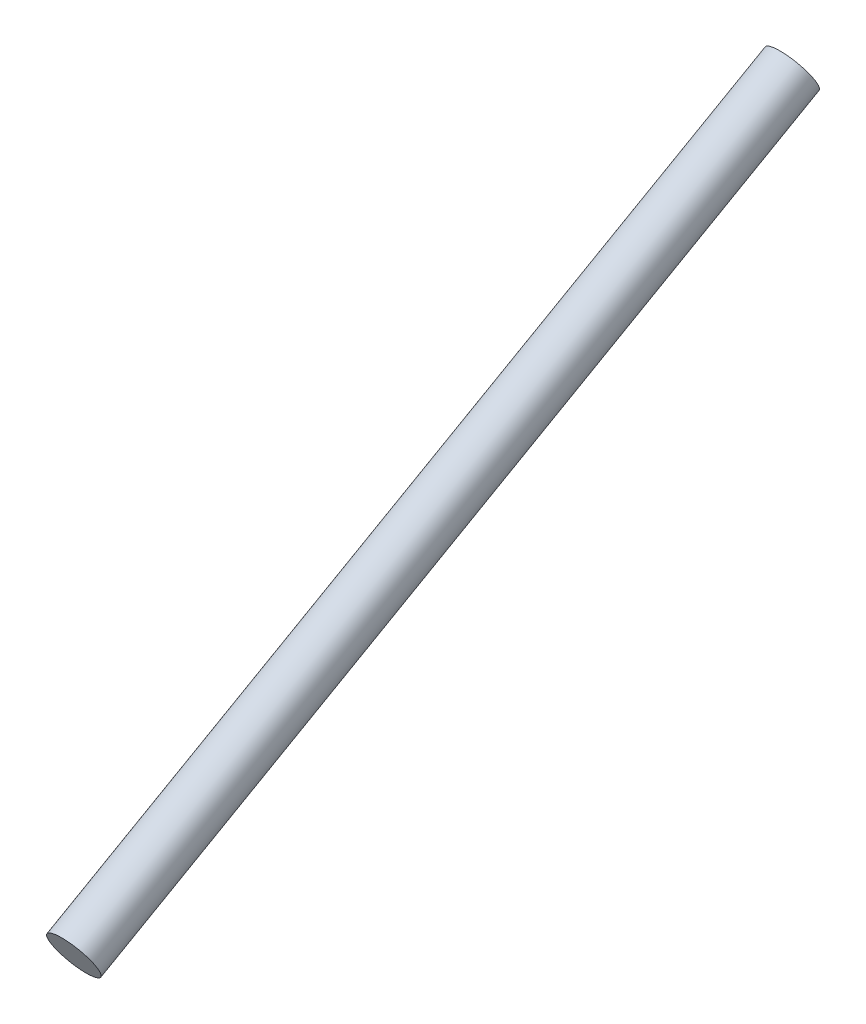
ISO-10303-21;
HEADER;
FILE_DESCRIPTION(('STEP AP214'),'2;1');
FILE_NAME('part.step','',(''),(''),'','','');
FILE_SCHEMA(('AUTOMOTIVE_DESIGN { 1 0 10303 214 1 1 1 1 }'));
ENDSEC;
DATA;
#1=APPLICATION_CONTEXT('core data for automotive mechanical design processes');
#2=APPLICATION_PROTOCOL_DEFINITION('international standard','automotive_design',2000,#1);
#3=PRODUCT_CONTEXT('',#1,'mechanical');
#4=PRODUCT('Part','Part','',(#3));
#5=PRODUCT_RELATED_PRODUCT_CATEGORY('part','',(#4));
#6=PRODUCT_DEFINITION_FORMATION('','',#4);
#7=PRODUCT_DEFINITION_CONTEXT('part definition',#1,'design');
#8=PRODUCT_DEFINITION('design','',#6,#7);
#9=PRODUCT_DEFINITION_SHAPE('','',#8);
#10=(LENGTH_UNIT() NAMED_UNIT(*) SI_UNIT(.MILLI.,.METRE.));
#11=(NAMED_UNIT(*) PLANE_ANGLE_UNIT() SI_UNIT($,.RADIAN.));
#12=(NAMED_UNIT(*) SI_UNIT($,.STERADIAN.) SOLID_ANGLE_UNIT());
#13=UNCERTAINTY_MEASURE_WITH_UNIT(LENGTH_MEASURE(1.E-05),#10,'distance_accuracy_value','');
#14=(GEOMETRIC_REPRESENTATION_CONTEXT(3) GLOBAL_UNCERTAINTY_ASSIGNED_CONTEXT((#13)) GLOBAL_UNIT_ASSIGNED_CONTEXT((#10,
#11,#12)) REPRESENTATION_CONTEXT('',''));
#15=CARTESIAN_POINT('',(0.,0.,0.));
#16=DIRECTION('',(0.,0.,1.));
#17=DIRECTION('',(1.,0.,0.));
#18=AXIS2_PLACEMENT_3D('',#15,#16,#17);
#19=CARTESIAN_POINT('',(0.,92.0756577668826,-56.2871822120563));
#20=DIRECTION('',(0.,-0.49473697194238,0.869042765687215));
#21=DIRECTION('',(0.,-0.869042765687215,-0.49473697194238));
#22=AXIS2_PLACEMENT_3D('',#19,#20,#21);
#23=CYLINDRICAL_SURFACE('',#22,4.);
#24=CARTESIAN_POINT('',(0.,92.0756577668826,-56.2871822120563));
#25=DIRECTION('',(0.,0.49473697194238,-0.869042765687215));
#26=DIRECTION('',(0.,0.869042765687215,0.49473697194238));
#27=AXIS2_PLACEMENT_3D('',#24,#25,#26);
#28=CIRCLE('',#27,4.);
#29=CARTESIAN_POINT('',(0.,95.5518288296315,-54.3082343242868));
#30=VERTEX_POINT('',#29);
#31=EDGE_CURVE('E10',#30,#30,#28,.T.);
#32=ORIENTED_EDGE('',*,*,#31,.F.);
#33=EDGE_LOOP('',(#32));
#34=FACE_BOUND('',#33,.T.);
#35=CARTESIAN_POINT('',(0.,25.3356402518556,60.9466868791491));
#36=DIRECTION('',(0.,0.49473697194238,-0.869042765687215));
#37=DIRECTION('',(0.,0.869042765687215,0.49473697194238));
#38=AXIS2_PLACEMENT_3D('',#35,#36,#37);
#39=CIRCLE('',#38,4.);
#40=CARTESIAN_POINT('',(0.,28.8118113146044,62.9256347669186));
#41=VERTEX_POINT('',#40);
#42=EDGE_CURVE('E44',#41,#41,#39,.T.);
#43=ORIENTED_EDGE('',*,*,#42,.T.);
#44=EDGE_LOOP('',(#43));
#45=FACE_BOUND('',#44,.T.);
#46=ADVANCED_FACE('F41',(#34,#45),#23,.T.);
#47=CARTESIAN_POINT('',(0.,92.0756577668826,-56.2871822120563));
#48=DIRECTION('',(0.,0.49473697194238,-0.869042765687215));
#49=DIRECTION('',(0.,0.869042765687215,0.49473697194238));
#50=AXIS2_PLACEMENT_3D('',#47,#48,#49);
#51=PLANE('',#50);
#52=ORIENTED_EDGE('',*,*,#31,.T.);
#53=EDGE_LOOP('',(#52));
#54=FACE_BOUND('',#53,.T.);
#55=ADVANCED_FACE('F56',(#54),#51,.T.);
#56=CARTESIAN_POINT('',(0.,25.3356402518556,60.9466868791491));
#57=DIRECTION('',(0.,0.49473697194238,-0.869042765687215));
#58=DIRECTION('',(0.,0.869042765687215,0.49473697194238));
#59=AXIS2_PLACEMENT_3D('',#56,#57,#58);
#60=PLANE('',#59);
#61=ORIENTED_EDGE('',*,*,#42,.F.);
#62=EDGE_LOOP('',(#61));
#63=FACE_BOUND('',#62,.T.);
#64=ADVANCED_FACE('F54',(#63),#60,.F.);
#65=CLOSED_SHELL('',(#46,#55,#64));
#66=MANIFOLD_SOLID_BREP('B2',#65);
#67=ADVANCED_BREP_SHAPE_REPRESENTATION('',(#18,#66),#14);
#68=SHAPE_DEFINITION_REPRESENTATION(#9,#67);
ENDSEC;
END-ISO-10303-21;
